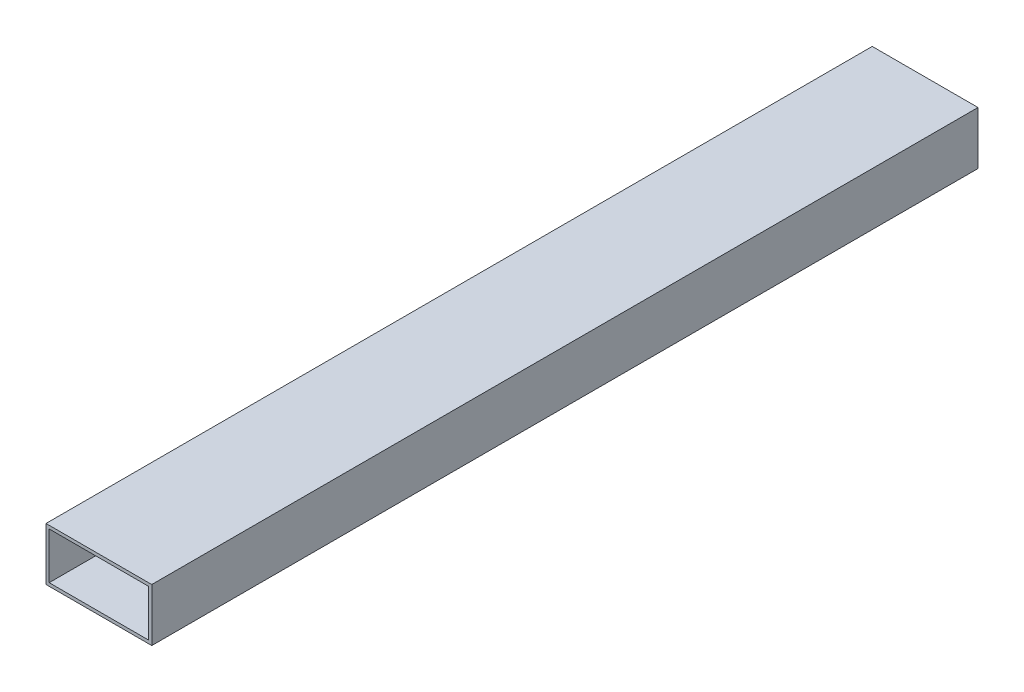
ISO-10303-21;
HEADER;
FILE_DESCRIPTION(('STEP AP214'),'2;1');
FILE_NAME('part.step','',(''),(''),'','','');
FILE_SCHEMA(('AUTOMOTIVE_DESIGN { 1 0 10303 214 1 1 1 1 }'));
ENDSEC;
DATA;
#1=APPLICATION_CONTEXT('core data for automotive mechanical design processes');
#2=APPLICATION_PROTOCOL_DEFINITION('international standard','automotive_design',2000,#1);
#3=PRODUCT_CONTEXT('',#1,'mechanical');
#4=PRODUCT('Part','Part','',(#3));
#5=PRODUCT_RELATED_PRODUCT_CATEGORY('part','',(#4));
#6=PRODUCT_DEFINITION_FORMATION('','',#4);
#7=PRODUCT_DEFINITION_CONTEXT('part definition',#1,'design');
#8=PRODUCT_DEFINITION('design','',#6,#7);
#9=PRODUCT_DEFINITION_SHAPE('','',#8);
#10=(LENGTH_UNIT() NAMED_UNIT(*) SI_UNIT(.MILLI.,.METRE.));
#11=(NAMED_UNIT(*) PLANE_ANGLE_UNIT() SI_UNIT($,.RADIAN.));
#12=(NAMED_UNIT(*) SI_UNIT($,.STERADIAN.) SOLID_ANGLE_UNIT());
#13=UNCERTAINTY_MEASURE_WITH_UNIT(LENGTH_MEASURE(1.E-05),#10,'distance_accuracy_value','');
#14=(GEOMETRIC_REPRESENTATION_CONTEXT(3) GLOBAL_UNCERTAINTY_ASSIGNED_CONTEXT((#13)) GLOBAL_UNIT_ASSIGNED_CONTEXT((#10,
#11,#12)) REPRESENTATION_CONTEXT('',''));
#15=CARTESIAN_POINT('',(0.,0.,0.));
#16=DIRECTION('',(0.,0.,1.));
#17=DIRECTION('',(1.,0.,0.));
#18=AXIS2_PLACEMENT_3D('',#15,#16,#17);
#19=CARTESIAN_POINT('',(0.,0.,396.875));
#20=DIRECTION('',(0.,0.,1.));
#21=DIRECTION('',(1.,0.,0.));
#22=AXIS2_PLACEMENT_3D('',#19,#20,#21);
#23=PLANE('',#22);
#24=DIRECTION('',(0.,1.,0.));
#25=VECTOR('',#24,1.);
#26=CARTESIAN_POINT('',(-81.2828799134661,22.6771343716335,396.875));
#27=LINE('',#26,#25);
#28=CARTESIAN_POINT('',(-81.2828799134661,22.6771343716335,396.875));
#29=VERTEX_POINT('',#28);
#30=CARTESIAN_POINT('',(-81.2828799134661,48.0771343716335,396.875));
#31=VERTEX_POINT('',#30);
#32=EDGE_CURVE('E162',#29,#31,#27,.T.);
#33=ORIENTED_EDGE('',*,*,#32,.T.);
#34=DIRECTION('',(-1.,0.,0.));
#35=VECTOR('',#34,1.);
#36=CARTESIAN_POINT('',(-81.2828799134661,48.0771343716335,396.875));
#37=LINE('',#36,#35);
#38=CARTESIAN_POINT('',(-132.082879913466,48.0771343716335,396.875));
#39=VERTEX_POINT('',#38);
#40=EDGE_CURVE('E165',#31,#39,#37,.T.);
#41=ORIENTED_EDGE('',*,*,#40,.T.);
#42=DIRECTION('',(0.,-1.,0.));
#43=VECTOR('',#42,1.);
#44=CARTESIAN_POINT('',(-132.082879913466,22.6771343716335,396.875));
#45=LINE('',#44,#43);
#46=CARTESIAN_POINT('',(-132.082879913466,22.6771343716335,396.875));
#47=VERTEX_POINT('',#46);
#48=EDGE_CURVE('E168',#39,#47,#45,.T.);
#49=ORIENTED_EDGE('',*,*,#48,.T.);
#50=DIRECTION('',(1.,0.,0.));
#51=VECTOR('',#50,1.);
#52=CARTESIAN_POINT('',(-81.2828799134661,22.6771343716335,396.875));
#53=LINE('',#52,#51);
#54=EDGE_CURVE('E170',#47,#29,#53,.T.);
#55=ORIENTED_EDGE('',*,*,#54,.T.);
#56=EDGE_LOOP('',(#33,#41,#49,#55));
#57=FACE_BOUND('',#56,.T.);
#58=DIRECTION('',(-1.,0.,0.));
#59=VECTOR('',#58,1.);
#60=CARTESIAN_POINT('',(-81.2828799134661,46.5531343716335,396.875));
#61=LINE('',#60,#59);
#62=CARTESIAN_POINT('',(-82.8068799134661,46.5531343716335,396.875));
#63=VERTEX_POINT('',#62);
#64=CARTESIAN_POINT('',(-130.558879913466,46.5531343716335,396.875));
#65=VERTEX_POINT('',#64);
#66=EDGE_CURVE('E134',#63,#65,#61,.T.);
#67=ORIENTED_EDGE('',*,*,#66,.F.);
#68=DIRECTION('',(0.,1.,0.));
#69=VECTOR('',#68,1.);
#70=CARTESIAN_POINT('',(-82.8068799134661,22.6771343716335,396.875));
#71=LINE('',#70,#69);
#72=CARTESIAN_POINT('',(-82.8068799134661,24.2011343716335,396.875));
#73=VERTEX_POINT('',#72);
#74=EDGE_CURVE('E126',#73,#63,#71,.T.);
#75=ORIENTED_EDGE('',*,*,#74,.F.);
#76=DIRECTION('',(1.,0.,0.));
#77=VECTOR('',#76,1.);
#78=CARTESIAN_POINT('',(-81.2828799134661,24.2011343716335,396.875));
#79=LINE('',#78,#77);
#80=CARTESIAN_POINT('',(-130.558879913466,24.2011343716335,396.875));
#81=VERTEX_POINT('',#80);
#82=EDGE_CURVE('E148',#81,#73,#79,.T.);
#83=ORIENTED_EDGE('',*,*,#82,.F.);
#84=DIRECTION('',(0.,-1.,0.));
#85=VECTOR('',#84,1.);
#86=CARTESIAN_POINT('',(-130.558879913466,22.6771343716335,396.875));
#87=LINE('',#86,#85);
#88=EDGE_CURVE('E146',#65,#81,#87,.T.);
#89=ORIENTED_EDGE('',*,*,#88,.F.);
#90=EDGE_LOOP('',(#67,#75,#83,#89));
#91=FACE_BOUND('',#90,.T.);
#92=ADVANCED_FACE('F61',(#57,#91),#23,.T.);
#93=CARTESIAN_POINT('',(0.,0.,0.));
#94=DIRECTION('',(0.,0.,1.));
#95=DIRECTION('',(1.,0.,0.));
#96=AXIS2_PLACEMENT_3D('',#93,#94,#95);
#97=PLANE('',#96);
#98=DIRECTION('',(0.,1.,0.));
#99=VECTOR('',#98,1.);
#100=CARTESIAN_POINT('',(-81.2828799134661,22.6771343716335,0.));
#101=LINE('',#100,#99);
#102=CARTESIAN_POINT('',(-81.2828799134661,22.6771343716335,0.));
#103=VERTEX_POINT('',#102);
#104=CARTESIAN_POINT('',(-81.2828799134661,48.0771343716335,0.));
#105=VERTEX_POINT('',#104);
#106=EDGE_CURVE('E142',#103,#105,#101,.T.);
#107=ORIENTED_EDGE('',*,*,#106,.F.);
#108=DIRECTION('',(1.,0.,0.));
#109=VECTOR('',#108,1.);
#110=CARTESIAN_POINT('',(-81.2828799134661,22.6771343716335,0.));
#111=LINE('',#110,#109);
#112=CARTESIAN_POINT('',(-132.082879913466,22.6771343716335,0.));
#113=VERTEX_POINT('',#112);
#114=EDGE_CURVE('E166',#113,#103,#111,.T.);
#115=ORIENTED_EDGE('',*,*,#114,.F.);
#116=DIRECTION('',(0.,-1.,0.));
#117=VECTOR('',#116,1.);
#118=CARTESIAN_POINT('',(-132.082879913466,22.6771343716335,0.));
#119=LINE('',#118,#117);
#120=CARTESIAN_POINT('',(-132.082879913466,48.0771343716335,0.));
#121=VERTEX_POINT('',#120);
#122=EDGE_CURVE('E177',#121,#113,#119,.T.);
#123=ORIENTED_EDGE('',*,*,#122,.F.);
#124=DIRECTION('',(-1.,0.,0.));
#125=VECTOR('',#124,1.);
#126=CARTESIAN_POINT('',(-81.2828799134661,48.0771343716335,0.));
#127=LINE('',#126,#125);
#128=EDGE_CURVE('E175',#105,#121,#127,.T.);
#129=ORIENTED_EDGE('',*,*,#128,.F.);
#130=EDGE_LOOP('',(#107,#115,#123,#129));
#131=FACE_BOUND('',#130,.T.);
#132=DIRECTION('',(0.,1.,0.));
#133=VECTOR('',#132,1.);
#134=CARTESIAN_POINT('',(-82.8068799134661,22.6771343716335,0.));
#135=LINE('',#134,#133);
#136=CARTESIAN_POINT('',(-82.8068799134661,24.2011343716335,0.));
#137=VERTEX_POINT('',#136);
#138=CARTESIAN_POINT('',(-82.8068799134661,46.5531343716335,0.));
#139=VERTEX_POINT('',#138);
#140=EDGE_CURVE('E84',#137,#139,#135,.T.);
#141=ORIENTED_EDGE('',*,*,#140,.T.);
#142=DIRECTION('',(-1.,0.,0.));
#143=VECTOR('',#142,1.);
#144=CARTESIAN_POINT('',(-81.2828799134661,46.5531343716335,0.));
#145=LINE('',#144,#143);
#146=CARTESIAN_POINT('',(-130.558879913466,46.5531343716335,0.));
#147=VERTEX_POINT('',#146);
#148=EDGE_CURVE('E141',#139,#147,#145,.T.);
#149=ORIENTED_EDGE('',*,*,#148,.T.);
#150=DIRECTION('',(0.,-1.,0.));
#151=VECTOR('',#150,1.);
#152=CARTESIAN_POINT('',(-130.558879913466,22.6771343716335,0.));
#153=LINE('',#152,#151);
#154=CARTESIAN_POINT('',(-130.558879913466,24.2011343716335,0.));
#155=VERTEX_POINT('',#154);
#156=EDGE_CURVE('E154',#147,#155,#153,.T.);
#157=ORIENTED_EDGE('',*,*,#156,.T.);
#158=DIRECTION('',(1.,0.,0.));
#159=VECTOR('',#158,1.);
#160=CARTESIAN_POINT('',(-81.2828799134661,24.2011343716335,0.));
#161=LINE('',#160,#159);
#162=EDGE_CURVE('E135',#155,#137,#161,.T.);
#163=ORIENTED_EDGE('',*,*,#162,.T.);
#164=EDGE_LOOP('',(#141,#149,#157,#163));
#165=FACE_BOUND('',#164,.T.);
#166=ADVANCED_FACE('F195',(#131,#165),#97,.F.);
#167=CARTESIAN_POINT('',(-81.2828799134661,22.6771343716335,396.875));
#168=DIRECTION('',(-1.,0.,0.));
#169=DIRECTION('',(0.,0.,1.));
#170=AXIS2_PLACEMENT_3D('',#167,#168,#169);
#171=PLANE('',#170);
#172=ORIENTED_EDGE('',*,*,#106,.T.);
#173=DIRECTION('',(0.,0.,-1.));
#174=VECTOR('',#173,1.);
#175=CARTESIAN_POINT('',(-81.2828799134661,48.0771343716335,396.875));
#176=LINE('',#175,#174);
#177=EDGE_CURVE('E12',#31,#105,#176,.T.);
#178=ORIENTED_EDGE('',*,*,#177,.F.);
#179=ORIENTED_EDGE('',*,*,#32,.F.);
#180=DIRECTION('',(0.,0.,-1.));
#181=VECTOR('',#180,1.);
#182=CARTESIAN_POINT('',(-81.2828799134661,22.6771343716335,396.875));
#183=LINE('',#182,#181);
#184=EDGE_CURVE('E172',#29,#103,#183,.T.);
#185=ORIENTED_EDGE('',*,*,#184,.T.);
#186=EDGE_LOOP('',(#172,#178,#179,#185));
#187=FACE_BOUND('',#186,.T.);
#188=ADVANCED_FACE('F63',(#187),#171,.F.);
#189=CARTESIAN_POINT('',(-81.2828799134661,48.0771343716335,396.875));
#190=DIRECTION('',(0.,-1.,0.));
#191=DIRECTION('',(1.,0.,0.));
#192=AXIS2_PLACEMENT_3D('',#189,#190,#191);
#193=PLANE('',#192);
#194=ORIENTED_EDGE('',*,*,#128,.T.);
#195=DIRECTION('',(0.,0.,-1.));
#196=VECTOR('',#195,1.);
#197=CARTESIAN_POINT('',(-132.082879913466,48.0771343716335,396.875));
#198=LINE('',#197,#196);
#199=EDGE_CURVE('E69',#39,#121,#198,.T.);
#200=ORIENTED_EDGE('',*,*,#199,.F.);
#201=ORIENTED_EDGE('',*,*,#40,.F.);
#202=ORIENTED_EDGE('',*,*,#177,.T.);
#203=EDGE_LOOP('',(#194,#200,#201,#202));
#204=FACE_BOUND('',#203,.T.);
#205=ADVANCED_FACE('F205',(#204),#193,.F.);
#206=CARTESIAN_POINT('',(-132.082879913466,22.6771343716335,396.875));
#207=DIRECTION('',(1.,0.,0.));
#208=DIRECTION('',(0.,0.,-1.));
#209=AXIS2_PLACEMENT_3D('',#206,#207,#208);
#210=PLANE('',#209);
#211=ORIENTED_EDGE('',*,*,#122,.T.);
#212=DIRECTION('',(0.,0.,-1.));
#213=VECTOR('',#212,1.);
#214=CARTESIAN_POINT('',(-132.082879913466,22.6771343716335,396.875));
#215=LINE('',#214,#213);
#216=EDGE_CURVE('E182',#47,#113,#215,.T.);
#217=ORIENTED_EDGE('',*,*,#216,.F.);
#218=ORIENTED_EDGE('',*,*,#48,.F.);
#219=ORIENTED_EDGE('',*,*,#199,.T.);
#220=EDGE_LOOP('',(#211,#217,#218,#219));
#221=FACE_BOUND('',#220,.T.);
#222=ADVANCED_FACE('F189',(#221),#210,.F.);
#223=CARTESIAN_POINT('',(-81.2828799134661,22.6771343716335,396.875));
#224=DIRECTION('',(0.,1.,0.));
#225=DIRECTION('',(-1.,0.,0.));
#226=AXIS2_PLACEMENT_3D('',#223,#224,#225);
#227=PLANE('',#226);
#228=ORIENTED_EDGE('',*,*,#114,.T.);
#229=ORIENTED_EDGE('',*,*,#184,.F.);
#230=ORIENTED_EDGE('',*,*,#54,.F.);
#231=ORIENTED_EDGE('',*,*,#216,.T.);
#232=EDGE_LOOP('',(#228,#229,#230,#231));
#233=FACE_BOUND('',#232,.T.);
#234=ADVANCED_FACE('F199',(#233),#227,.F.);
#235=CARTESIAN_POINT('',(-82.8068799134661,22.6771343716335,396.875));
#236=DIRECTION('',(-1.,0.,0.));
#237=DIRECTION('',(0.,0.,1.));
#238=AXIS2_PLACEMENT_3D('',#235,#236,#237);
#239=PLANE('',#238);
#240=ORIENTED_EDGE('',*,*,#140,.F.);
#241=DIRECTION('',(0.,0.,-1.));
#242=VECTOR('',#241,1.);
#243=CARTESIAN_POINT('',(-82.8068799134661,24.2011343716335,396.875));
#244=LINE('',#243,#242);
#245=EDGE_CURVE('E130',#73,#137,#244,.T.);
#246=ORIENTED_EDGE('',*,*,#245,.F.);
#247=ORIENTED_EDGE('',*,*,#74,.T.);
#248=DIRECTION('',(0.,0.,-1.));
#249=VECTOR('',#248,1.);
#250=CARTESIAN_POINT('',(-82.8068799134661,46.5531343716335,396.875));
#251=LINE('',#250,#249);
#252=EDGE_CURVE('E129',#63,#139,#251,.T.);
#253=ORIENTED_EDGE('',*,*,#252,.T.);
#254=EDGE_LOOP('',(#240,#246,#247,#253));
#255=FACE_BOUND('',#254,.T.);
#256=ADVANCED_FACE('F128',(#255),#239,.T.);
#257=CARTESIAN_POINT('',(-81.2828799134661,46.5531343716335,396.875));
#258=DIRECTION('',(0.,-1.,0.));
#259=DIRECTION('',(1.,0.,0.));
#260=AXIS2_PLACEMENT_3D('',#257,#258,#259);
#261=PLANE('',#260);
#262=ORIENTED_EDGE('',*,*,#148,.F.);
#263=ORIENTED_EDGE('',*,*,#252,.F.);
#264=ORIENTED_EDGE('',*,*,#66,.T.);
#265=DIRECTION('',(0.,0.,-1.));
#266=VECTOR('',#265,1.);
#267=CARTESIAN_POINT('',(-130.558879913466,46.5531343716335,396.875));
#268=LINE('',#267,#266);
#269=EDGE_CURVE('E143',#65,#147,#268,.T.);
#270=ORIENTED_EDGE('',*,*,#269,.T.);
#271=EDGE_LOOP('',(#262,#263,#264,#270));
#272=FACE_BOUND('',#271,.T.);
#273=ADVANCED_FACE('F138',(#272),#261,.T.);
#274=CARTESIAN_POINT('',(-130.558879913466,22.6771343716335,396.875));
#275=DIRECTION('',(1.,0.,0.));
#276=DIRECTION('',(0.,0.,-1.));
#277=AXIS2_PLACEMENT_3D('',#274,#275,#276);
#278=PLANE('',#277);
#279=ORIENTED_EDGE('',*,*,#156,.F.);
#280=ORIENTED_EDGE('',*,*,#269,.F.);
#281=ORIENTED_EDGE('',*,*,#88,.T.);
#282=DIRECTION('',(0.,0.,-1.));
#283=VECTOR('',#282,1.);
#284=CARTESIAN_POINT('',(-130.558879913466,24.2011343716335,396.875));
#285=LINE('',#284,#283);
#286=EDGE_CURVE('E76',#81,#155,#285,.T.);
#287=ORIENTED_EDGE('',*,*,#286,.T.);
#288=EDGE_LOOP('',(#279,#280,#281,#287));
#289=FACE_BOUND('',#288,.T.);
#290=ADVANCED_FACE('F228',(#289),#278,.T.);
#291=CARTESIAN_POINT('',(-81.2828799134661,24.2011343716335,396.875));
#292=DIRECTION('',(0.,1.,0.));
#293=DIRECTION('',(-1.,0.,0.));
#294=AXIS2_PLACEMENT_3D('',#291,#292,#293);
#295=PLANE('',#294);
#296=ORIENTED_EDGE('',*,*,#162,.F.);
#297=ORIENTED_EDGE('',*,*,#286,.F.);
#298=ORIENTED_EDGE('',*,*,#82,.T.);
#299=ORIENTED_EDGE('',*,*,#245,.T.);
#300=EDGE_LOOP('',(#296,#297,#298,#299));
#301=FACE_BOUND('',#300,.T.);
#302=ADVANCED_FACE('F232',(#301),#295,.T.);
#303=CLOSED_SHELL('',(#92,#166,#188,#205,#222,#234,#256,#273,#290,#302));
#304=MANIFOLD_SOLID_BREP('B2',#303);
#305=ADVANCED_BREP_SHAPE_REPRESENTATION('',(#18,#304),#14);
#306=SHAPE_DEFINITION_REPRESENTATION(#9,#305);
ENDSEC;
END-ISO-10303-21;
